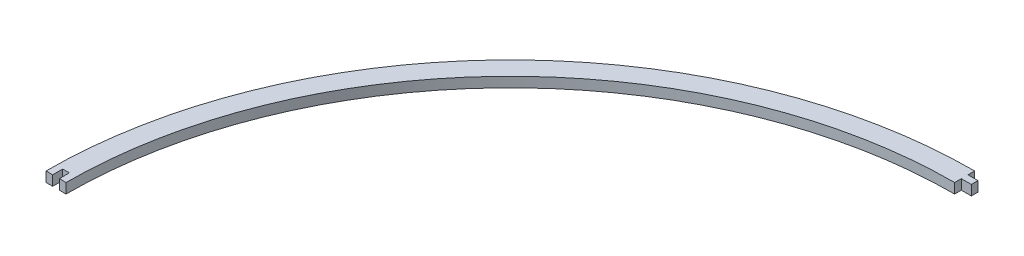
ISO-10303-21;
HEADER;
FILE_DESCRIPTION(('STEP AP214'),'2;1');
FILE_NAME('part.step','',(''),(''),'','','');
FILE_SCHEMA(('AUTOMOTIVE_DESIGN { 1 0 10303 214 1 1 1 1 }'));
ENDSEC;
DATA;
#1=APPLICATION_CONTEXT('core data for automotive mechanical design processes');
#2=APPLICATION_PROTOCOL_DEFINITION('international standard','automotive_design',2000,#1);
#3=PRODUCT_CONTEXT('',#1,'mechanical');
#4=PRODUCT('Part','Part','',(#3));
#5=PRODUCT_RELATED_PRODUCT_CATEGORY('part','',(#4));
#6=PRODUCT_DEFINITION_FORMATION('','',#4);
#7=PRODUCT_DEFINITION_CONTEXT('part definition',#1,'design');
#8=PRODUCT_DEFINITION('design','',#6,#7);
#9=PRODUCT_DEFINITION_SHAPE('','',#8);
#10=(LENGTH_UNIT() NAMED_UNIT(*) SI_UNIT(.MILLI.,.METRE.));
#11=(NAMED_UNIT(*) PLANE_ANGLE_UNIT() SI_UNIT($,.RADIAN.));
#12=(NAMED_UNIT(*) SI_UNIT($,.STERADIAN.) SOLID_ANGLE_UNIT());
#13=UNCERTAINTY_MEASURE_WITH_UNIT(LENGTH_MEASURE(1.E-05),#10,'distance_accuracy_value','');
#14=(GEOMETRIC_REPRESENTATION_CONTEXT(3) GLOBAL_UNCERTAINTY_ASSIGNED_CONTEXT((#13)) GLOBAL_UNIT_ASSIGNED_CONTEXT((#10,
#11,#12)) REPRESENTATION_CONTEXT('',''));
#15=CARTESIAN_POINT('',(0.,0.,0.));
#16=DIRECTION('',(0.,0.,1.));
#17=DIRECTION('',(1.,0.,0.));
#18=AXIS2_PLACEMENT_3D('',#15,#16,#17);
#19=CARTESIAN_POINT('',(0.,6.35,0.));
#20=DIRECTION('',(1.,0.,0.));
#21=DIRECTION('',(0.,0.,-1.));
#22=AXIS2_PLACEMENT_3D('',#19,#20,#21);
#23=PLANE('',#22);
#24=DIRECTION('',(0.,0.,1.));
#25=VECTOR('',#24,1.);
#26=CARTESIAN_POINT('',(0.,0.,0.));
#27=LINE('',#26,#25);
#28=CARTESIAN_POINT('',(0.,0.,-294.386));
#29=VERTEX_POINT('',#28);
#30=CARTESIAN_POINT('',(0.,0.,-290.152666666667));
#31=VERTEX_POINT('',#30);
#32=EDGE_CURVE('E152',#29,#31,#27,.T.);
#33=ORIENTED_EDGE('',*,*,#32,.F.);
#34=DIRECTION('',(0.,-1.,0.));
#35=VECTOR('',#34,1.);
#36=CARTESIAN_POINT('',(0.,6.35,-294.386));
#37=LINE('',#36,#35);
#38=CARTESIAN_POINT('',(0.,6.35,-294.386));
#39=VERTEX_POINT('',#38);
#40=EDGE_CURVE('E11',#39,#29,#37,.T.);
#41=ORIENTED_EDGE('',*,*,#40,.F.);
#42=DIRECTION('',(0.,0.,1.));
#43=VECTOR('',#42,1.);
#44=CARTESIAN_POINT('',(0.,6.35,0.));
#45=LINE('',#44,#43);
#46=CARTESIAN_POINT('',(0.,6.35,-290.152666666667));
#47=VERTEX_POINT('',#46);
#48=EDGE_CURVE('E184',#39,#47,#45,.T.);
#49=ORIENTED_EDGE('',*,*,#48,.T.);
#50=DIRECTION('',(0.,-1.,0.));
#51=VECTOR('',#50,1.);
#52=CARTESIAN_POINT('',(0.,6.35,-290.152666666667));
#53=LINE('',#52,#51);
#54=EDGE_CURVE('E50',#47,#31,#53,.T.);
#55=ORIENTED_EDGE('',*,*,#54,.T.);
#56=EDGE_LOOP('',(#33,#41,#49,#55));
#57=FACE_BOUND('',#56,.T.);
#58=ADVANCED_FACE('F34',(#57),#23,.T.);
#59=CARTESIAN_POINT('',(0.,6.35,0.));
#60=DIRECTION('',(0.,-1.,0.));
#61=DIRECTION('',(0.,0.,-1.));
#62=AXIS2_PLACEMENT_3D('',#59,#60,#61);
#63=CYLINDRICAL_SURFACE('',#62,294.386);
#64=CARTESIAN_POINT('',(0.,0.,0.));
#65=DIRECTION('',(0.,1.,0.));
#66=DIRECTION('',(0.,0.,1.));
#67=AXIS2_PLACEMENT_3D('',#64,#65,#66);
#68=CIRCLE('',#67,294.386);
#69=CARTESIAN_POINT('',(-294.386,0.,0.));
#70=VERTEX_POINT('',#69);
#71=EDGE_CURVE('E154',#29,#70,#68,.T.);
#72=ORIENTED_EDGE('',*,*,#71,.T.);
#73=DIRECTION('',(0.,-1.,0.));
#74=VECTOR('',#73,1.);
#75=CARTESIAN_POINT('',(-294.386,6.35,0.));
#76=LINE('',#75,#74);
#77=CARTESIAN_POINT('',(-294.386,6.35,0.));
#78=VERTEX_POINT('',#77);
#79=EDGE_CURVE('E42',#78,#70,#76,.T.);
#80=ORIENTED_EDGE('',*,*,#79,.F.);
#81=CARTESIAN_POINT('',(0.,6.35,0.));
#82=DIRECTION('',(0.,1.,0.));
#83=DIRECTION('',(0.,0.,1.));
#84=AXIS2_PLACEMENT_3D('',#81,#82,#83);
#85=CIRCLE('',#84,294.386);
#86=EDGE_CURVE('E220',#39,#78,#85,.T.);
#87=ORIENTED_EDGE('',*,*,#86,.F.);
#88=ORIENTED_EDGE('',*,*,#40,.T.);
#89=EDGE_LOOP('',(#72,#80,#87,#88));
#90=FACE_BOUND('',#89,.T.);
#91=ADVANCED_FACE('F208',(#90),#63,.T.);
#92=CARTESIAN_POINT('',(0.,6.35,0.));
#93=DIRECTION('',(0.,0.,1.));
#94=DIRECTION('',(1.,0.,0.));
#95=AXIS2_PLACEMENT_3D('',#92,#93,#94);
#96=PLANE('',#95);
#97=DIRECTION('',(-1.,0.,0.));
#98=VECTOR('',#97,1.);
#99=CARTESIAN_POINT('',(0.,0.,0.));
#100=LINE('',#99,#98);
#101=CARTESIAN_POINT('',(-290.152666666667,0.,0.));
#102=VERTEX_POINT('',#101);
#103=EDGE_CURVE('E157',#102,#70,#100,.T.);
#104=ORIENTED_EDGE('',*,*,#103,.F.);
#105=DIRECTION('',(0.,-1.,0.));
#106=VECTOR('',#105,1.);
#107=CARTESIAN_POINT('',(-290.152666666667,6.35,0.));
#108=LINE('',#107,#106);
#109=CARTESIAN_POINT('',(-290.152666666667,6.35,0.));
#110=VERTEX_POINT('',#109);
#111=EDGE_CURVE('E198',#110,#102,#108,.T.);
#112=ORIENTED_EDGE('',*,*,#111,.F.);
#113=DIRECTION('',(-1.,0.,0.));
#114=VECTOR('',#113,1.);
#115=CARTESIAN_POINT('',(0.,6.35,0.));
#116=LINE('',#115,#114);
#117=EDGE_CURVE('E205',#110,#78,#116,.T.);
#118=ORIENTED_EDGE('',*,*,#117,.T.);
#119=ORIENTED_EDGE('',*,*,#79,.T.);
#120=EDGE_LOOP('',(#104,#112,#118,#119));
#121=FACE_BOUND('',#120,.T.);
#122=ADVANCED_FACE('F203',(#121),#96,.T.);
#123=CARTESIAN_POINT('',(-290.152666666667,6.35,-2.53648953692694E-12));
#124=DIRECTION('',(1.,0.,0.));
#125=DIRECTION('',(0.,0.,-1.));
#126=AXIS2_PLACEMENT_3D('',#123,#124,#125);
#127=PLANE('',#126);
#128=DIRECTION('',(0.,0.,1.));
#129=VECTOR('',#128,1.);
#130=CARTESIAN_POINT('',(-290.152666666667,0.,-2.53648953692694E-12));
#131=LINE('',#130,#129);
#132=CARTESIAN_POINT('',(-290.152666666667,0.,-6.35));
#133=VERTEX_POINT('',#132);
#134=EDGE_CURVE('E160',#133,#102,#131,.T.);
#135=ORIENTED_EDGE('',*,*,#134,.F.);
#136=DIRECTION('',(0.,-1.,0.));
#137=VECTOR('',#136,1.);
#138=CARTESIAN_POINT('',(-290.152666666667,6.35,-6.35));
#139=LINE('',#138,#137);
#140=CARTESIAN_POINT('',(-290.152666666667,6.35,-6.35));
#141=VERTEX_POINT('',#140);
#142=EDGE_CURVE('E196',#141,#133,#139,.T.);
#143=ORIENTED_EDGE('',*,*,#142,.F.);
#144=DIRECTION('',(0.,0.,1.));
#145=VECTOR('',#144,1.);
#146=CARTESIAN_POINT('',(-290.152666666667,6.35,-2.53648953692694E-12));
#147=LINE('',#146,#145);
#148=EDGE_CURVE('E217',#141,#110,#147,.T.);
#149=ORIENTED_EDGE('',*,*,#148,.T.);
#150=ORIENTED_EDGE('',*,*,#111,.T.);
#151=EDGE_LOOP('',(#135,#143,#149,#150));
#152=FACE_BOUND('',#151,.T.);
#153=ADVANCED_FACE('F214',(#152),#127,.T.);
#154=CARTESIAN_POINT('',(0.,6.35,-6.35));
#155=DIRECTION('',(0.,0.,1.));
#156=DIRECTION('',(1.,0.,0.));
#157=AXIS2_PLACEMENT_3D('',#154,#155,#156);
#158=PLANE('',#157);
#159=DIRECTION('',(-1.,0.,0.));
#160=VECTOR('',#159,1.);
#161=CARTESIAN_POINT('',(0.,0.,-6.35));
#162=LINE('',#161,#160);
#163=CARTESIAN_POINT('',(-285.919333333333,0.,-6.35));
#164=VERTEX_POINT('',#163);
#165=EDGE_CURVE('E163',#164,#133,#162,.T.);
#166=ORIENTED_EDGE('',*,*,#165,.F.);
#167=DIRECTION('',(0.,-1.,0.));
#168=VECTOR('',#167,1.);
#169=CARTESIAN_POINT('',(-285.919333333333,6.35,-6.35));
#170=LINE('',#169,#168);
#171=CARTESIAN_POINT('',(-285.919333333333,6.35,-6.35));
#172=VERTEX_POINT('',#171);
#173=EDGE_CURVE('E194',#172,#164,#170,.T.);
#174=ORIENTED_EDGE('',*,*,#173,.F.);
#175=DIRECTION('',(-1.,0.,0.));
#176=VECTOR('',#175,1.);
#177=CARTESIAN_POINT('',(0.,6.35,-6.35));
#178=LINE('',#177,#176);
#179=EDGE_CURVE('E222',#172,#141,#178,.T.);
#180=ORIENTED_EDGE('',*,*,#179,.T.);
#181=ORIENTED_EDGE('',*,*,#142,.T.);
#182=EDGE_LOOP('',(#166,#174,#180,#181));
#183=FACE_BOUND('',#182,.T.);
#184=ADVANCED_FACE('F261',(#183),#158,.T.);
#185=CARTESIAN_POINT('',(-285.919333333333,6.35,-2.49948210277277E-12));
#186=DIRECTION('',(-1.,0.,0.));
#187=DIRECTION('',(0.,0.,1.));
#188=AXIS2_PLACEMENT_3D('',#185,#186,#187);
#189=PLANE('',#188);
#190=DIRECTION('',(0.,0.,-1.));
#191=VECTOR('',#190,1.);
#192=CARTESIAN_POINT('',(-285.919333333333,0.,-2.49948210277277E-12));
#193=LINE('',#192,#191);
#194=CARTESIAN_POINT('',(-285.919333333333,0.,0.));
#195=VERTEX_POINT('',#194);
#196=EDGE_CURVE('E166',#195,#164,#193,.T.);
#197=ORIENTED_EDGE('',*,*,#196,.F.);
#198=DIRECTION('',(0.,-1.,0.));
#199=VECTOR('',#198,1.);
#200=CARTESIAN_POINT('',(-285.919333333333,6.35,0.));
#201=LINE('',#200,#199);
#202=CARTESIAN_POINT('',(-285.919333333333,6.35,0.));
#203=VERTEX_POINT('',#202);
#204=EDGE_CURVE('E192',#203,#195,#201,.T.);
#205=ORIENTED_EDGE('',*,*,#204,.F.);
#206=DIRECTION('',(0.,0.,-1.));
#207=VECTOR('',#206,1.);
#208=CARTESIAN_POINT('',(-285.919333333333,6.35,-2.49948210277277E-12));
#209=LINE('',#208,#207);
#210=EDGE_CURVE('E228',#203,#172,#209,.T.);
#211=ORIENTED_EDGE('',*,*,#210,.T.);
#212=ORIENTED_EDGE('',*,*,#173,.T.);
#213=EDGE_LOOP('',(#197,#205,#211,#212));
#214=FACE_BOUND('',#213,.T.);
#215=ADVANCED_FACE('F264',(#214),#189,.T.);
#216=CARTESIAN_POINT('',(0.,6.35,0.));
#217=DIRECTION('',(0.,0.,1.));
#218=DIRECTION('',(1.,0.,0.));
#219=AXIS2_PLACEMENT_3D('',#216,#217,#218);
#220=PLANE('',#219);
#221=DIRECTION('',(-1.,0.,0.));
#222=VECTOR('',#221,1.);
#223=CARTESIAN_POINT('',(0.,0.,0.));
#224=LINE('',#223,#222);
#225=CARTESIAN_POINT('',(-281.686,0.,0.));
#226=VERTEX_POINT('',#225);
#227=EDGE_CURVE('E169',#226,#195,#224,.T.);
#228=ORIENTED_EDGE('',*,*,#227,.F.);
#229=DIRECTION('',(0.,-1.,0.));
#230=VECTOR('',#229,1.);
#231=CARTESIAN_POINT('',(-281.686,6.35,0.));
#232=LINE('',#231,#230);
#233=CARTESIAN_POINT('',(-281.686,6.35,0.));
#234=VERTEX_POINT('',#233);
#235=EDGE_CURVE('E190',#234,#226,#232,.T.);
#236=ORIENTED_EDGE('',*,*,#235,.F.);
#237=DIRECTION('',(-1.,0.,0.));
#238=VECTOR('',#237,1.);
#239=CARTESIAN_POINT('',(0.,6.35,0.));
#240=LINE('',#239,#238);
#241=EDGE_CURVE('E231',#234,#203,#240,.T.);
#242=ORIENTED_EDGE('',*,*,#241,.T.);
#243=ORIENTED_EDGE('',*,*,#204,.T.);
#244=EDGE_LOOP('',(#228,#236,#242,#243));
#245=FACE_BOUND('',#244,.T.);
#246=ADVANCED_FACE('F268',(#245),#220,.T.);
#247=CARTESIAN_POINT('',(0.,6.35,0.));
#248=DIRECTION('',(0.,-1.,0.));
#249=DIRECTION('',(0.,0.,-1.));
#250=AXIS2_PLACEMENT_3D('',#247,#248,#249);
#251=CYLINDRICAL_SURFACE('',#250,281.686);
#252=CARTESIAN_POINT('',(0.,0.,0.));
#253=DIRECTION('',(0.,1.,0.));
#254=DIRECTION('',(0.,0.,1.));
#255=AXIS2_PLACEMENT_3D('',#252,#253,#254);
#256=CIRCLE('',#255,281.686);
#257=CARTESIAN_POINT('',(0.,0.,-281.686));
#258=VERTEX_POINT('',#257);
#259=EDGE_CURVE('E172',#258,#226,#256,.T.);
#260=ORIENTED_EDGE('',*,*,#259,.F.);
#261=DIRECTION('',(0.,-1.,0.));
#262=VECTOR('',#261,1.);
#263=CARTESIAN_POINT('',(0.,6.35,-281.686));
#264=LINE('',#263,#262);
#265=CARTESIAN_POINT('',(0.,6.35,-281.686));
#266=VERTEX_POINT('',#265);
#267=EDGE_CURVE('E188',#266,#258,#264,.T.);
#268=ORIENTED_EDGE('',*,*,#267,.F.);
#269=CARTESIAN_POINT('',(0.,6.35,0.));
#270=DIRECTION('',(0.,1.,0.));
#271=DIRECTION('',(0.,0.,1.));
#272=AXIS2_PLACEMENT_3D('',#269,#270,#271);
#273=CIRCLE('',#272,281.686);
#274=EDGE_CURVE('E234',#266,#234,#273,.T.);
#275=ORIENTED_EDGE('',*,*,#274,.T.);
#276=ORIENTED_EDGE('',*,*,#235,.T.);
#277=EDGE_LOOP('',(#260,#268,#275,#276));
#278=FACE_BOUND('',#277,.T.);
#279=ADVANCED_FACE('F272',(#278),#251,.F.);
#280=CARTESIAN_POINT('',(0.,6.35,0.));
#281=DIRECTION('',(1.,0.,0.));
#282=DIRECTION('',(0.,0.,-1.));
#283=AXIS2_PLACEMENT_3D('',#280,#281,#282);
#284=PLANE('',#283);
#285=DIRECTION('',(0.,0.,1.));
#286=VECTOR('',#285,1.);
#287=CARTESIAN_POINT('',(0.,0.,0.));
#288=LINE('',#287,#286);
#289=CARTESIAN_POINT('',(0.,0.,-285.919333333333));
#290=VERTEX_POINT('',#289);
#291=EDGE_CURVE('E175',#290,#258,#288,.T.);
#292=ORIENTED_EDGE('',*,*,#291,.F.);
#293=DIRECTION('',(0.,-1.,0.));
#294=VECTOR('',#293,1.);
#295=CARTESIAN_POINT('',(0.,6.35,-285.919333333333));
#296=LINE('',#295,#294);
#297=CARTESIAN_POINT('',(0.,6.35,-285.919333333333));
#298=VERTEX_POINT('',#297);
#299=EDGE_CURVE('E133',#298,#290,#296,.T.);
#300=ORIENTED_EDGE('',*,*,#299,.F.);
#301=DIRECTION('',(0.,0.,1.));
#302=VECTOR('',#301,1.);
#303=CARTESIAN_POINT('',(0.,6.35,0.));
#304=LINE('',#303,#302);
#305=EDGE_CURVE('E144',#298,#266,#304,.T.);
#306=ORIENTED_EDGE('',*,*,#305,.T.);
#307=ORIENTED_EDGE('',*,*,#267,.T.);
#308=EDGE_LOOP('',(#292,#300,#306,#307));
#309=FACE_BOUND('',#308,.T.);
#310=ADVANCED_FACE('F238',(#309),#284,.T.);
#311=CARTESIAN_POINT('',(2.49948210277277E-12,6.35,-285.919333333333));
#312=DIRECTION('',(0.,0.,1.));
#313=DIRECTION('',(1.,0.,0.));
#314=AXIS2_PLACEMENT_3D('',#311,#312,#313);
#315=PLANE('',#314);
#316=DIRECTION('',(-1.,0.,0.));
#317=VECTOR('',#316,1.);
#318=CARTESIAN_POINT('',(2.49948210277277E-12,0.,-285.919333333333));
#319=LINE('',#318,#317);
#320=CARTESIAN_POINT('',(6.35,0.,-285.919333333333));
#321=VERTEX_POINT('',#320);
#322=EDGE_CURVE('E129',#321,#290,#319,.T.);
#323=ORIENTED_EDGE('',*,*,#322,.F.);
#324=DIRECTION('',(0.,-1.,0.));
#325=VECTOR('',#324,1.);
#326=CARTESIAN_POINT('',(6.35,6.35,-285.919333333333));
#327=LINE('',#326,#325);
#328=CARTESIAN_POINT('',(6.35,6.35,-285.919333333333));
#329=VERTEX_POINT('',#328);
#330=EDGE_CURVE('E124',#329,#321,#327,.T.);
#331=ORIENTED_EDGE('',*,*,#330,.F.);
#332=DIRECTION('',(-1.,0.,0.));
#333=VECTOR('',#332,1.);
#334=CARTESIAN_POINT('',(2.49948210277277E-12,6.35,-285.919333333333));
#335=LINE('',#334,#333);
#336=EDGE_CURVE('E127',#329,#298,#335,.T.);
#337=ORIENTED_EDGE('',*,*,#336,.T.);
#338=ORIENTED_EDGE('',*,*,#299,.T.);
#339=EDGE_LOOP('',(#323,#331,#337,#338));
#340=FACE_BOUND('',#339,.T.);
#341=ADVANCED_FACE('F126',(#340),#315,.T.);
#342=CARTESIAN_POINT('',(6.35,6.35,0.));
#343=DIRECTION('',(1.,0.,0.));
#344=DIRECTION('',(0.,0.,-1.));
#345=AXIS2_PLACEMENT_3D('',#342,#343,#344);
#346=PLANE('',#345);
#347=DIRECTION('',(0.,0.,1.));
#348=VECTOR('',#347,1.);
#349=CARTESIAN_POINT('',(6.35,0.,0.));
#350=LINE('',#349,#348);
#351=CARTESIAN_POINT('',(6.35,0.,-290.152666666667));
#352=VERTEX_POINT('',#351);
#353=EDGE_CURVE('E179',#352,#321,#350,.T.);
#354=ORIENTED_EDGE('',*,*,#353,.F.);
#355=DIRECTION('',(0.,-1.,0.));
#356=VECTOR('',#355,1.);
#357=CARTESIAN_POINT('',(6.35,6.35,-290.152666666667));
#358=LINE('',#357,#356);
#359=CARTESIAN_POINT('',(6.35,6.35,-290.152666666667));
#360=VERTEX_POINT('',#359);
#361=EDGE_CURVE('E87',#360,#352,#358,.T.);
#362=ORIENTED_EDGE('',*,*,#361,.F.);
#363=DIRECTION('',(0.,0.,1.));
#364=VECTOR('',#363,1.);
#365=CARTESIAN_POINT('',(6.35,6.35,0.));
#366=LINE('',#365,#364);
#367=EDGE_CURVE('E141',#360,#329,#366,.T.);
#368=ORIENTED_EDGE('',*,*,#367,.T.);
#369=ORIENTED_EDGE('',*,*,#330,.T.);
#370=EDGE_LOOP('',(#354,#362,#368,#369));
#371=FACE_BOUND('',#370,.T.);
#372=ADVANCED_FACE('F146',(#371),#346,.T.);
#373=CARTESIAN_POINT('',(2.53648953692694E-12,6.35,-290.152666666667));
#374=DIRECTION('',(0.,0.,-1.));
#375=DIRECTION('',(-1.,0.,0.));
#376=AXIS2_PLACEMENT_3D('',#373,#374,#375);
#377=PLANE('',#376);
#378=DIRECTION('',(1.,0.,0.));
#379=VECTOR('',#378,1.);
#380=CARTESIAN_POINT('',(2.53648953692694E-12,0.,-290.152666666667));
#381=LINE('',#380,#379);
#382=EDGE_CURVE('E181',#31,#352,#381,.T.);
#383=ORIENTED_EDGE('',*,*,#382,.F.);
#384=ORIENTED_EDGE('',*,*,#54,.F.);
#385=DIRECTION('',(1.,0.,0.));
#386=VECTOR('',#385,1.);
#387=CARTESIAN_POINT('',(2.53648953692694E-12,6.35,-290.152666666667));
#388=LINE('',#387,#386);
#389=EDGE_CURVE('E147',#47,#360,#388,.T.);
#390=ORIENTED_EDGE('',*,*,#389,.T.);
#391=ORIENTED_EDGE('',*,*,#361,.T.);
#392=EDGE_LOOP('',(#383,#384,#390,#391));
#393=FACE_BOUND('',#392,.T.);
#394=ADVANCED_FACE('F240',(#393),#377,.T.);
#395=CARTESIAN_POINT('',(0.,6.35,0.));
#396=DIRECTION('',(0.,1.,0.));
#397=DIRECTION('',(0.,0.,1.));
#398=AXIS2_PLACEMENT_3D('',#395,#396,#397);
#399=PLANE('',#398);
#400=ORIENTED_EDGE('',*,*,#48,.F.);
#401=ORIENTED_EDGE('',*,*,#86,.T.);
#402=ORIENTED_EDGE('',*,*,#117,.F.);
#403=ORIENTED_EDGE('',*,*,#148,.F.);
#404=ORIENTED_EDGE('',*,*,#179,.F.);
#405=ORIENTED_EDGE('',*,*,#210,.F.);
#406=ORIENTED_EDGE('',*,*,#241,.F.);
#407=ORIENTED_EDGE('',*,*,#274,.F.);
#408=ORIENTED_EDGE('',*,*,#305,.F.);
#409=ORIENTED_EDGE('',*,*,#336,.F.);
#410=ORIENTED_EDGE('',*,*,#367,.F.);
#411=ORIENTED_EDGE('',*,*,#389,.F.);
#412=EDGE_LOOP('',(#400,#401,#402,#403,#404,#405,#406,#407,#408,#409,#410,#411));
#413=FACE_BOUND('',#412,.T.);
#414=ADVANCED_FACE('F139',(#413),#399,.T.);
#415=CARTESIAN_POINT('',(0.,0.,0.));
#416=DIRECTION('',(0.,1.,0.));
#417=DIRECTION('',(0.,0.,1.));
#418=AXIS2_PLACEMENT_3D('',#415,#416,#417);
#419=PLANE('',#418);
#420=ORIENTED_EDGE('',*,*,#32,.T.);
#421=ORIENTED_EDGE('',*,*,#382,.T.);
#422=ORIENTED_EDGE('',*,*,#353,.T.);
#423=ORIENTED_EDGE('',*,*,#322,.T.);
#424=ORIENTED_EDGE('',*,*,#291,.T.);
#425=ORIENTED_EDGE('',*,*,#259,.T.);
#426=ORIENTED_EDGE('',*,*,#227,.T.);
#427=ORIENTED_EDGE('',*,*,#196,.T.);
#428=ORIENTED_EDGE('',*,*,#165,.T.);
#429=ORIENTED_EDGE('',*,*,#134,.T.);
#430=ORIENTED_EDGE('',*,*,#103,.T.);
#431=ORIENTED_EDGE('',*,*,#71,.F.);
#432=EDGE_LOOP('',(#420,#421,#422,#423,#424,#425,#426,#427,#428,#429,#430,#431));
#433=FACE_BOUND('',#432,.T.);
#434=ADVANCED_FACE('F210',(#433),#419,.F.);
#435=CLOSED_SHELL('',(#58,#91,#122,#153,#184,#215,#246,#279,#310,#341,#372,#394,#414,#434));
#436=MANIFOLD_SOLID_BREP('B2',#435);
#437=ADVANCED_BREP_SHAPE_REPRESENTATION('',(#18,#436),#14);
#438=SHAPE_DEFINITION_REPRESENTATION(#9,#437);
ENDSEC;
END-ISO-10303-21;
